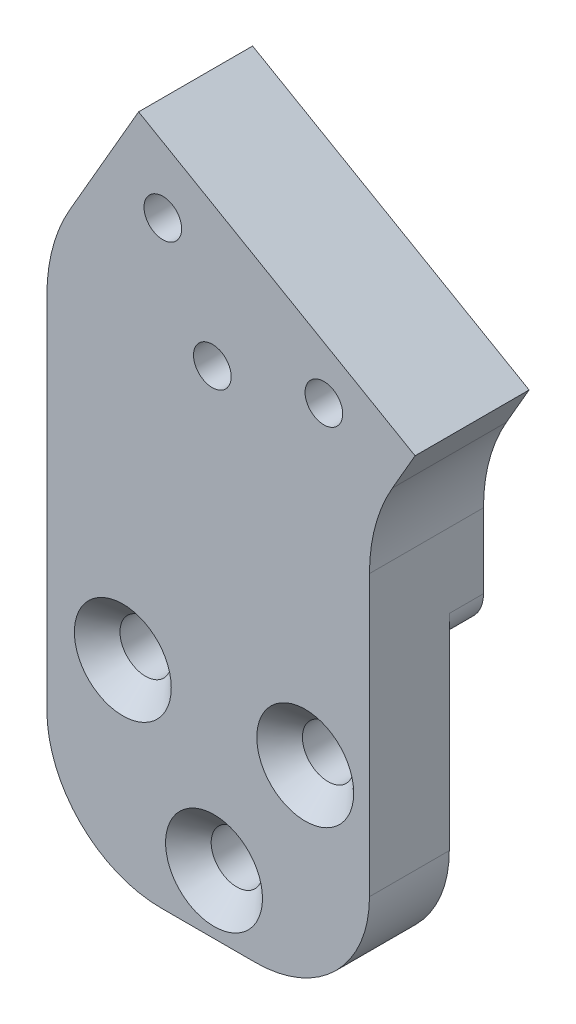
ISO-10303-21;
HEADER;
FILE_DESCRIPTION(('STEP AP214'),'2;1');
FILE_NAME('part.step','',(''),(''),'','','');
FILE_SCHEMA(('AUTOMOTIVE_DESIGN { 1 0 10303 214 1 1 1 1 }'));
ENDSEC;
DATA;
#1=APPLICATION_CONTEXT('core data for automotive mechanical design processes');
#2=APPLICATION_PROTOCOL_DEFINITION('international standard','automotive_design',2000,#1);
#3=PRODUCT_CONTEXT('',#1,'mechanical');
#4=PRODUCT('Part','Part','',(#3));
#5=PRODUCT_RELATED_PRODUCT_CATEGORY('part','',(#4));
#6=PRODUCT_DEFINITION_FORMATION('','',#4);
#7=PRODUCT_DEFINITION_CONTEXT('part definition',#1,'design');
#8=PRODUCT_DEFINITION('design','',#6,#7);
#9=PRODUCT_DEFINITION_SHAPE('','',#8);
#10=(LENGTH_UNIT() NAMED_UNIT(*) SI_UNIT(.MILLI.,.METRE.));
#11=(NAMED_UNIT(*) PLANE_ANGLE_UNIT() SI_UNIT($,.RADIAN.));
#12=(NAMED_UNIT(*) SI_UNIT($,.STERADIAN.) SOLID_ANGLE_UNIT());
#13=UNCERTAINTY_MEASURE_WITH_UNIT(LENGTH_MEASURE(1.E-05),#10,'distance_accuracy_value','');
#14=(GEOMETRIC_REPRESENTATION_CONTEXT(3) GLOBAL_UNCERTAINTY_ASSIGNED_CONTEXT((#13)) GLOBAL_UNIT_ASSIGNED_CONTEXT((#10,
#11,#12)) REPRESENTATION_CONTEXT('',''));
#15=CARTESIAN_POINT('',(0.,0.,0.));
#16=DIRECTION('',(0.,0.,1.));
#17=DIRECTION('',(1.,0.,0.));
#18=AXIS2_PLACEMENT_3D('',#15,#16,#17);
#19=CARTESIAN_POINT('',(-14.6578980201125,119.616999760779,-1.));
#20=DIRECTION('',(0.,-1.,0.));
#21=DIRECTION('',(0.,0.,-1.));
#22=AXIS2_PLACEMENT_3D('',#19,#20,#21);
#23=PLANE('',#22);
#24=DIRECTION('',(1.,0.,0.));
#25=VECTOR('',#24,1.);
#26=CARTESIAN_POINT('',(-14.6578980201125,119.616999760779,9.));
#27=LINE('',#26,#25);
#28=CARTESIAN_POINT('',(-4.65789802011249,119.616999760779,9.));
#29=VERTEX_POINT('',#28);
#30=CARTESIAN_POINT('',(3.63305587300541,119.616999760779,9.));
#31=VERTEX_POINT('',#30);
#32=EDGE_CURVE('E167',#29,#31,#27,.T.);
#33=ORIENTED_EDGE('',*,*,#32,.F.);
#34=DIRECTION('',(0.,0.,1.));
#35=VECTOR('',#34,1.);
#36=CARTESIAN_POINT('',(-4.65789802011249,119.616999760779,-1.));
#37=LINE('',#36,#35);
#38=CARTESIAN_POINT('',(-4.65789802011249,119.616999760779,2.));
#39=VERTEX_POINT('',#38);
#40=EDGE_CURVE('E228',#29,#39,#37,.F.);
#41=ORIENTED_EDGE('',*,*,#40,.T.);
#42=DIRECTION('',(1.,0.,0.));
#43=VECTOR('',#42,1.);
#44=CARTESIAN_POINT('',(-14.6578980201125,119.616999760779,2.));
#45=LINE('',#44,#43);
#46=CARTESIAN_POINT('',(3.63305587300541,119.616999760779,2.));
#47=VERTEX_POINT('',#46);
#48=EDGE_CURVE('E274',#39,#47,#45,.T.);
#49=ORIENTED_EDGE('',*,*,#48,.T.);
#50=DIRECTION('',(0.,0.,1.));
#51=VECTOR('',#50,1.);
#52=CARTESIAN_POINT('',(3.63305587300541,119.616999760779,-1.));
#53=LINE('',#52,#51);
#54=EDGE_CURVE('E225',#47,#31,#53,.T.);
#55=ORIENTED_EDGE('',*,*,#54,.T.);
#56=EDGE_LOOP('',(#33,#41,#49,#55));
#57=FACE_BOUND('',#56,.T.);
#58=ADVANCED_FACE('F33',(#57),#23,.T.);
#59=CARTESIAN_POINT('',(-14.6578980201125,119.616999760779,-1.));
#60=DIRECTION('',(-1.,0.,0.));
#61=DIRECTION('',(0.,0.,1.));
#62=AXIS2_PLACEMENT_3D('',#59,#60,#61);
#63=PLANE('',#62);
#64=DIRECTION('',(0.,-1.,0.));
#65=VECTOR('',#64,1.);
#66=CARTESIAN_POINT('',(-14.6578980201125,158.176865611019,-1.));
#67=LINE('',#66,#65);
#68=CARTESIAN_POINT('',(-14.6578980201125,161.156258187083,-1.));
#69=VERTEX_POINT('',#68);
#70=CARTESIAN_POINT('',(-14.6578980201125,147.55521431191,-1.));
#71=VERTEX_POINT('',#70);
#72=EDGE_CURVE('E157',#69,#71,#67,.T.);
#73=ORIENTED_EDGE('',*,*,#72,.T.);
#74=DIRECTION('',(0.,0.,1.));
#75=VECTOR('',#74,1.);
#76=CARTESIAN_POINT('',(-14.6578980201125,147.55521431191,2.));
#77=LINE('',#76,#75);
#78=CARTESIAN_POINT('',(-14.6578980201125,147.55521431191,2.));
#79=VERTEX_POINT('',#78);
#80=EDGE_CURVE('E247',#71,#79,#77,.T.);
#81=ORIENTED_EDGE('',*,*,#80,.T.);
#82=DIRECTION('',(0.,-1.,0.));
#83=VECTOR('',#82,1.);
#84=CARTESIAN_POINT('',(-14.6578980201125,119.616999760779,2.));
#85=LINE('',#84,#83);
#86=CARTESIAN_POINT('',(-14.6578980201125,129.616999760779,2.));
#87=VERTEX_POINT('',#86);
#88=EDGE_CURVE('E47',#79,#87,#85,.T.);
#89=ORIENTED_EDGE('',*,*,#88,.T.);
#90=DIRECTION('',(0.,0.,1.));
#91=VECTOR('',#90,1.);
#92=CARTESIAN_POINT('',(-14.6578980201125,129.616999760779,-1.));
#93=LINE('',#92,#91);
#94=CARTESIAN_POINT('',(-14.6578980201125,129.616999760779,9.));
#95=VERTEX_POINT('',#94);
#96=EDGE_CURVE('E218',#87,#95,#93,.T.);
#97=ORIENTED_EDGE('',*,*,#96,.T.);
#98=DIRECTION('',(0.,-1.,0.));
#99=VECTOR('',#98,1.);
#100=CARTESIAN_POINT('',(-14.6578980201125,158.176865611019,9.));
#101=LINE('',#100,#99);
#102=CARTESIAN_POINT('',(-14.6578980201125,161.156258187083,9.));
#103=VERTEX_POINT('',#102);
#104=EDGE_CURVE('E162',#103,#95,#101,.T.);
#105=ORIENTED_EDGE('',*,*,#104,.F.);
#106=DIRECTION('',(0.,0.,1.));
#107=VECTOR('',#106,1.);
#108=CARTESIAN_POINT('',(-14.6578980201125,161.156258187083,-1.));
#109=LINE('',#108,#107);
#110=EDGE_CURVE('E210',#103,#69,#109,.F.);
#111=ORIENTED_EDGE('',*,*,#110,.T.);
#112=EDGE_LOOP('',(#73,#81,#89,#97,#105,#111));
#113=FACE_BOUND('',#112,.T.);
#114=ADVANCED_FACE('F345',(#113),#63,.T.);
#115=CARTESIAN_POINT('',(-10.6156554329589,172.176865611019,-1.));
#116=DIRECTION('',(-0.866025403784438,0.500000000000001,0.));
#117=DIRECTION('',(-0.500000000000001,-0.866025403784438,0.));
#118=AXIS2_PLACEMENT_3D('',#115,#116,#117);
#119=PLANE('',#118);
#120=DIRECTION('',(-0.500000000000001,-0.866025403784438,0.));
#121=VECTOR('',#120,1.);
#122=CARTESIAN_POINT('',(-6.61565543295897,179.105068841294,-1.));
#123=LINE('',#122,#121);
#124=CARTESIAN_POINT('',(-6.61565543295897,179.105068841294,-1.));
#125=VERTEX_POINT('',#124);
#126=CARTESIAN_POINT('',(-12.6482790768791,168.656258187083,-1.));
#127=VERTEX_POINT('',#126);
#128=EDGE_CURVE('E175',#125,#127,#123,.T.);
#129=ORIENTED_EDGE('',*,*,#128,.T.);
#130=DIRECTION('',(0.,0.,1.));
#131=VECTOR('',#130,1.);
#132=CARTESIAN_POINT('',(-12.6482790768791,168.656258187083,-1.));
#133=LINE('',#132,#131);
#134=CARTESIAN_POINT('',(-12.6482790768791,168.656258187083,9.));
#135=VERTEX_POINT('',#134);
#136=EDGE_CURVE('E205',#127,#135,#133,.T.);
#137=ORIENTED_EDGE('',*,*,#136,.T.);
#138=DIRECTION('',(-0.500000000000001,-0.866025403784438,0.));
#139=VECTOR('',#138,1.);
#140=CARTESIAN_POINT('',(-6.61565543295897,179.105068841294,9.));
#141=LINE('',#140,#139);
#142=CARTESIAN_POINT('',(-6.61565543295897,179.105068841294,9.));
#143=VERTEX_POINT('',#142);
#144=EDGE_CURVE('E160',#143,#135,#141,.T.);
#145=ORIENTED_EDGE('',*,*,#144,.F.);
#146=DIRECTION('',(0.,0.,1.));
#147=VECTOR('',#146,1.);
#148=CARTESIAN_POINT('',(-6.61565543295897,179.105068841294,-1.));
#149=LINE('',#148,#147);
#150=EDGE_CURVE('E156',#125,#143,#149,.T.);
#151=ORIENTED_EDGE('',*,*,#150,.F.);
#152=EDGE_LOOP('',(#129,#137,#145,#151));
#153=FACE_BOUND('',#152,.T.);
#154=ADVANCED_FACE('F350',(#153),#119,.T.);
#155=CARTESIAN_POINT('',(-6.61565543295897,179.105068841294,-1.));
#156=DIRECTION('',(0.499999999999995,0.866025403784442,0.));
#157=DIRECTION('',(-0.866025403784442,0.499999999999995,0.));
#158=AXIS2_PLACEMENT_3D('',#155,#156,#157);
#159=PLANE('',#158);
#160=ORIENTED_EDGE('',*,*,#150,.T.);
#161=DIRECTION('',(-0.866025403784442,0.499999999999995,0.));
#162=VECTOR('',#161,1.);
#163=CARTESIAN_POINT('',(-6.61565543295897,179.105068841294,9.));
#164=LINE('',#163,#162);
#165=CARTESIAN_POINT('',(17.6330558730054,165.105068841294,9.));
#166=VERTEX_POINT('',#165);
#167=EDGE_CURVE('E140',#166,#143,#164,.T.);
#168=ORIENTED_EDGE('',*,*,#167,.F.);
#169=DIRECTION('',(0.,0.,1.));
#170=VECTOR('',#169,1.);
#171=CARTESIAN_POINT('',(17.6330558730054,165.105068841294,-1.));
#172=LINE('',#171,#170);
#173=CARTESIAN_POINT('',(17.6330558730054,165.105068841294,-1.));
#174=VERTEX_POINT('',#173);
#175=EDGE_CURVE('E149',#174,#166,#172,.T.);
#176=ORIENTED_EDGE('',*,*,#175,.F.);
#177=DIRECTION('',(-0.866025403784442,0.499999999999995,0.));
#178=VECTOR('',#177,1.);
#179=CARTESIAN_POINT('',(-6.61565543295897,179.105068841294,-1.));
#180=LINE('',#179,#178);
#181=EDGE_CURVE('E173',#174,#125,#180,.T.);
#182=ORIENTED_EDGE('',*,*,#181,.T.);
#183=EDGE_LOOP('',(#160,#168,#176,#182));
#184=FACE_BOUND('',#183,.T.);
#185=ADVANCED_FACE('F159',(#184),#159,.T.);
#186=CARTESIAN_POINT('',(17.6330558730054,165.105068841294,-1.));
#187=DIRECTION('',(0.866025403784442,-0.499999999999995,0.));
#188=DIRECTION('',(0.499999999999995,0.866025403784442,0.));
#189=AXIS2_PLACEMENT_3D('',#186,#187,#188);
#190=PLANE('',#189);
#191=DIRECTION('',(0.499999999999995,0.866025403784442,0.));
#192=VECTOR('',#191,1.);
#193=CARTESIAN_POINT('',(17.6330558730054,165.105068841294,9.));
#194=LINE('',#193,#192);
#195=CARTESIAN_POINT('',(15.6426748162388,161.657627724552,9.));
#196=VERTEX_POINT('',#195);
#197=EDGE_CURVE('E134',#196,#166,#194,.T.);
#198=ORIENTED_EDGE('',*,*,#197,.F.);
#199=DIRECTION('',(0.,0.,1.));
#200=VECTOR('',#199,1.);
#201=CARTESIAN_POINT('',(15.6426748162388,161.657627724552,-1.));
#202=LINE('',#201,#200);
#203=CARTESIAN_POINT('',(15.6426748162388,161.657627724552,-1.));
#204=VERTEX_POINT('',#203);
#205=EDGE_CURVE('E203',#196,#204,#202,.F.);
#206=ORIENTED_EDGE('',*,*,#205,.T.);
#207=DIRECTION('',(0.499999999999995,0.866025403784442,0.));
#208=VECTOR('',#207,1.);
#209=CARTESIAN_POINT('',(17.6330558730054,165.105068841294,-1.));
#210=LINE('',#209,#208);
#211=EDGE_CURVE('E152',#204,#174,#210,.T.);
#212=ORIENTED_EDGE('',*,*,#211,.T.);
#213=ORIENTED_EDGE('',*,*,#175,.T.);
#214=EDGE_LOOP('',(#198,#206,#212,#213));
#215=FACE_BOUND('',#214,.T.);
#216=ADVANCED_FACE('F150',(#215),#190,.T.);
#217=CARTESIAN_POINT('',(13.6330558730054,158.176865611019,-1.));
#218=DIRECTION('',(1.,0.,0.));
#219=DIRECTION('',(0.,0.,-1.));
#220=AXIS2_PLACEMENT_3D('',#217,#218,#219);
#221=PLANE('',#220);
#222=DIRECTION('',(0.,1.,0.));
#223=VECTOR('',#222,1.);
#224=CARTESIAN_POINT('',(13.6330558730054,158.176865611019,2.));
#225=LINE('',#224,#223);
#226=CARTESIAN_POINT('',(13.6330558730054,129.616999760779,2.));
#227=VERTEX_POINT('',#226);
#228=CARTESIAN_POINT('',(13.6330558730054,147.630069523674,2.));
#229=VERTEX_POINT('',#228);
#230=EDGE_CURVE('E183',#227,#229,#225,.T.);
#231=ORIENTED_EDGE('',*,*,#230,.T.);
#232=DIRECTION('',(0.,0.,1.));
#233=VECTOR('',#232,1.);
#234=CARTESIAN_POINT('',(13.6330558730054,147.630069523674,-1.));
#235=LINE('',#234,#233);
#236=CARTESIAN_POINT('',(13.6330558730054,147.630069523674,-1.));
#237=VERTEX_POINT('',#236);
#238=EDGE_CURVE('E242',#229,#237,#235,.F.);
#239=ORIENTED_EDGE('',*,*,#238,.T.);
#240=DIRECTION('',(0.,1.,0.));
#241=VECTOR('',#240,1.);
#242=CARTESIAN_POINT('',(13.6330558730054,119.616999760779,-1.));
#243=LINE('',#242,#241);
#244=CARTESIAN_POINT('',(13.6330558730054,154.157627724552,-1.));
#245=VERTEX_POINT('',#244);
#246=EDGE_CURVE('E170',#237,#245,#243,.T.);
#247=ORIENTED_EDGE('',*,*,#246,.T.);
#248=DIRECTION('',(0.,0.,1.));
#249=VECTOR('',#248,1.);
#250=CARTESIAN_POINT('',(13.6330558730054,154.157627724552,9.));
#251=LINE('',#250,#249);
#252=CARTESIAN_POINT('',(13.6330558730054,154.157627724552,9.));
#253=VERTEX_POINT('',#252);
#254=EDGE_CURVE('E185',#245,#253,#251,.T.);
#255=ORIENTED_EDGE('',*,*,#254,.T.);
#256=DIRECTION('',(0.,1.,0.));
#257=VECTOR('',#256,1.);
#258=CARTESIAN_POINT('',(13.6330558730054,119.616999760779,9.));
#259=LINE('',#258,#257);
#260=CARTESIAN_POINT('',(13.6330558730054,129.616999760779,9.));
#261=VERTEX_POINT('',#260);
#262=EDGE_CURVE('E146',#261,#253,#259,.T.);
#263=ORIENTED_EDGE('',*,*,#262,.F.);
#264=DIRECTION('',(0.,0.,1.));
#265=VECTOR('',#264,1.);
#266=CARTESIAN_POINT('',(13.6330558730054,129.616999760779,-1.));
#267=LINE('',#266,#265);
#268=EDGE_CURVE('E234',#261,#227,#267,.F.);
#269=ORIENTED_EDGE('',*,*,#268,.T.);
#270=EDGE_LOOP('',(#231,#239,#247,#255,#263,#269));
#271=FACE_BOUND('',#270,.T.);
#272=ADVANCED_FACE('F262',(#271),#221,.T.);
#273=CARTESIAN_POINT('',(0.,0.,-1.));
#274=DIRECTION('',(0.,0.,-1.));
#275=DIRECTION('',(-1.,0.,0.));
#276=AXIS2_PLACEMENT_3D('',#273,#274,#275);
#277=PLANE('',#276);
#278=CARTESIAN_POINT('',(-4.4912997799768,172.105068841294,-1.));
#279=DIRECTION('',(0.,0.,-1.));
#280=DIRECTION('',(-1.,0.,0.));
#281=AXIS2_PLACEMENT_3D('',#278,#279,#280);
#282=CIRCLE('',#281,1.65000000000001);
#283=CARTESIAN_POINT('',(-6.1412997799768,172.105068841294,-1.));
#284=VERTEX_POINT('',#283);
#285=EDGE_CURVE('E309',#284,#284,#282,.T.);
#286=ORIENTED_EDGE('',*,*,#285,.F.);
#287=EDGE_LOOP('',(#286));
#288=FACE_BOUND('',#287,.T.);
#289=CARTESIAN_POINT('',(9.63305587300538,165.105068841294,-1.));
#290=DIRECTION('',(0.,0.,-1.));
#291=DIRECTION('',(-1.,0.,0.));
#292=AXIS2_PLACEMENT_3D('',#289,#290,#291);
#293=CIRCLE('',#292,1.65000000000001);
#294=CARTESIAN_POINT('',(7.98305587300537,165.105068841294,-1.));
#295=VERTEX_POINT('',#294);
#296=EDGE_CURVE('E303',#295,#295,#293,.T.);
#297=ORIENTED_EDGE('',*,*,#296,.F.);
#298=EDGE_LOOP('',(#297));
#299=FACE_BOUND('',#298,.T.);
#300=CARTESIAN_POINT('',(-0.146785414448515,163.038543863621,-1.));
#301=DIRECTION('',(0.,0.,-1.));
#302=DIRECTION('',(-1.,0.,0.));
#303=AXIS2_PLACEMENT_3D('',#300,#301,#302);
#304=CIRCLE('',#303,1.65000000000001);
#305=CARTESIAN_POINT('',(-1.79678541444852,163.038543863621,-1.));
#306=VERTEX_POINT('',#305);
#307=EDGE_CURVE('E297',#306,#306,#304,.T.);
#308=ORIENTED_EDGE('',*,*,#307,.F.);
#309=EDGE_LOOP('',(#308));
#310=FACE_BOUND('',#309,.T.);
#311=ORIENTED_EDGE('',*,*,#246,.F.);
#312=CARTESIAN_POINT('',(10.6330558730054,147.630069523674,-1.));
#313=DIRECTION('',(0.,0.,-1.));
#314=DIRECTION('',(-1.,0.,0.));
#315=AXIS2_PLACEMENT_3D('',#312,#313,#314);
#316=CIRCLE('',#315,3.);
#317=CARTESIAN_POINT('',(10.4245645813779,144.637323062426,-1.));
#318=VERTEX_POINT('',#317);
#319=EDGE_CURVE('E245',#237,#318,#316,.T.);
#320=ORIENTED_EDGE('',*,*,#319,.T.);
#321=CARTESIAN_POINT('',(0.,-4.99999999999998,-1.));
#322=DIRECTION('',(0.,0.,-1.));
#323=DIRECTION('',(-1.,0.,0.));
#324=AXIS2_PLACEMENT_3D('',#321,#322,#323);
#325=CIRCLE('',#324,150.);
#326=CARTESIAN_POINT('',(-11.429311784424,144.563935599911,-1.));
#327=VERTEX_POINT('',#326);
#328=EDGE_CURVE('E179',#327,#318,#325,.T.);
#329=ORIENTED_EDGE('',*,*,#328,.F.);
#330=CARTESIAN_POINT('',(-11.6578980201125,147.55521431191,-1.));
#331=DIRECTION('',(0.,0.,-1.));
#332=DIRECTION('',(-1.,0.,0.));
#333=AXIS2_PLACEMENT_3D('',#330,#331,#332);
#334=CIRCLE('',#333,3.);
#335=EDGE_CURVE('E55',#327,#71,#334,.T.);
#336=ORIENTED_EDGE('',*,*,#335,.T.);
#337=ORIENTED_EDGE('',*,*,#72,.F.);
#338=CARTESIAN_POINT('',(0.342101979887509,161.156258187083,-1.));
#339=DIRECTION('',(0.,0.,-1.));
#340=DIRECTION('',(-1.,0.,0.));
#341=AXIS2_PLACEMENT_3D('',#338,#339,#340);
#342=CIRCLE('',#341,15.);
#343=EDGE_CURVE('E212',#69,#127,#342,.T.);
#344=ORIENTED_EDGE('',*,*,#343,.T.);
#345=ORIENTED_EDGE('',*,*,#128,.F.);
#346=ORIENTED_EDGE('',*,*,#181,.F.);
#347=ORIENTED_EDGE('',*,*,#211,.F.);
#348=CARTESIAN_POINT('',(28.6330558730054,154.157627724552,-1.));
#349=DIRECTION('',(0.,0.,-1.));
#350=DIRECTION('',(-1.,0.,0.));
#351=AXIS2_PLACEMENT_3D('',#348,#349,#350);
#352=CIRCLE('',#351,15.);
#353=EDGE_CURVE('E215',#204,#245,#352,.F.);
#354=ORIENTED_EDGE('',*,*,#353,.T.);
#355=EDGE_LOOP('',(#311,#320,#329,#336,#337,#344,#345,#346,#347,#354));
#356=FACE_BOUND('',#355,.T.);
#357=ADVANCED_FACE('F263',(#288,#299,#310,#356),#277,.T.);
#358=CARTESIAN_POINT('',(0.,0.,9.));
#359=DIRECTION('',(0.,0.,-1.));
#360=DIRECTION('',(-1.,0.,0.));
#361=AXIS2_PLACEMENT_3D('',#358,#359,#360);
#362=PLANE('',#361);
#363=CARTESIAN_POINT('',(-4.4912997799768,172.105068841294,9.));
#364=DIRECTION('',(0.,0.,-1.));
#365=DIRECTION('',(-1.,0.,0.));
#366=AXIS2_PLACEMENT_3D('',#363,#364,#365);
#367=CIRCLE('',#366,1.65000000000001);
#368=CARTESIAN_POINT('',(-6.1412997799768,172.105068841294,9.));
#369=VERTEX_POINT('',#368);
#370=EDGE_CURVE('E296',#369,#369,#367,.T.);
#371=ORIENTED_EDGE('',*,*,#370,.T.);
#372=EDGE_LOOP('',(#371));
#373=FACE_BOUND('',#372,.T.);
#374=CARTESIAN_POINT('',(9.63305587300538,165.105068841294,9.));
#375=DIRECTION('',(0.,0.,-1.));
#376=DIRECTION('',(-1.,0.,0.));
#377=AXIS2_PLACEMENT_3D('',#374,#375,#376);
#378=CIRCLE('',#377,1.65000000000001);
#379=CARTESIAN_POINT('',(7.98305587300537,165.105068841294,9.));
#380=VERTEX_POINT('',#379);
#381=EDGE_CURVE('E306',#380,#380,#378,.T.);
#382=ORIENTED_EDGE('',*,*,#381,.T.);
#383=EDGE_LOOP('',(#382));
#384=FACE_BOUND('',#383,.T.);
#385=CARTESIAN_POINT('',(-0.146785414448515,163.038543863621,9.));
#386=DIRECTION('',(0.,0.,-1.));
#387=DIRECTION('',(-1.,0.,0.));
#388=AXIS2_PLACEMENT_3D('',#385,#386,#387);
#389=CIRCLE('',#388,1.65000000000001);
#390=CARTESIAN_POINT('',(-1.79678541444852,163.038543863621,9.));
#391=VERTEX_POINT('',#390);
#392=EDGE_CURVE('E300',#391,#391,#389,.T.);
#393=ORIENTED_EDGE('',*,*,#392,.T.);
#394=EDGE_LOOP('',(#393));
#395=FACE_BOUND('',#394,.T.);
#396=CARTESIAN_POINT('',(8.,136.785930713577,9.));
#397=DIRECTION('',(0.,0.,1.));
#398=DIRECTION('',(1.,0.,0.));
#399=AXIS2_PLACEMENT_3D('',#396,#397,#398);
#400=CIRCLE('',#399,4.25);
#401=CARTESIAN_POINT('',(12.25,136.785930713577,9.));
#402=VERTEX_POINT('',#401);
#403=EDGE_CURVE('E293',#402,#402,#400,.T.);
#404=ORIENTED_EDGE('',*,*,#403,.F.);
#405=EDGE_LOOP('',(#404));
#406=FACE_BOUND('',#405,.T.);
#407=CARTESIAN_POINT('',(-8.,136.785930713577,9.));
#408=DIRECTION('',(0.,0.,1.));
#409=DIRECTION('',(1.,0.,0.));
#410=AXIS2_PLACEMENT_3D('',#407,#408,#409);
#411=CIRCLE('',#410,4.25);
#412=CARTESIAN_POINT('',(-3.75,136.785930713577,9.));
#413=VERTEX_POINT('',#412);
#414=EDGE_CURVE('E199',#413,#413,#411,.T.);
#415=ORIENTED_EDGE('',*,*,#414,.F.);
#416=EDGE_LOOP('',(#415));
#417=FACE_BOUND('',#416,.T.);
#418=CARTESIAN_POINT('',(0.,124.785930713577,9.));
#419=DIRECTION('',(0.,0.,1.));
#420=DIRECTION('',(1.,0.,0.));
#421=AXIS2_PLACEMENT_3D('',#418,#419,#420);
#422=CIRCLE('',#421,4.25);
#423=CARTESIAN_POINT('',(4.25,124.785930713577,9.));
#424=VERTEX_POINT('',#423);
#425=EDGE_CURVE('E194',#424,#424,#422,.T.);
#426=ORIENTED_EDGE('',*,*,#425,.F.);
#427=EDGE_LOOP('',(#426));
#428=FACE_BOUND('',#427,.T.);
#429=ORIENTED_EDGE('',*,*,#104,.T.);
#430=CARTESIAN_POINT('',(-4.65789802011249,129.616999760779,9.));
#431=DIRECTION('',(0.,0.,-1.));
#432=DIRECTION('',(-1.,0.,0.));
#433=AXIS2_PLACEMENT_3D('',#430,#431,#432);
#434=CIRCLE('',#433,10.);
#435=EDGE_CURVE('E223',#95,#29,#434,.F.);
#436=ORIENTED_EDGE('',*,*,#435,.T.);
#437=ORIENTED_EDGE('',*,*,#32,.T.);
#438=CARTESIAN_POINT('',(3.63305587300541,129.616999760779,9.));
#439=DIRECTION('',(0.,0.,-1.));
#440=DIRECTION('',(-1.,0.,0.));
#441=AXIS2_PLACEMENT_3D('',#438,#439,#440);
#442=CIRCLE('',#441,10.);
#443=EDGE_CURVE('E221',#31,#261,#442,.F.);
#444=ORIENTED_EDGE('',*,*,#443,.T.);
#445=ORIENTED_EDGE('',*,*,#262,.T.);
#446=CARTESIAN_POINT('',(28.6330558730054,154.157627724552,9.));
#447=DIRECTION('',(0.,0.,-1.));
#448=DIRECTION('',(-1.,0.,0.));
#449=AXIS2_PLACEMENT_3D('',#446,#447,#448);
#450=CIRCLE('',#449,15.);
#451=EDGE_CURVE('E143',#253,#196,#450,.T.);
#452=ORIENTED_EDGE('',*,*,#451,.T.);
#453=ORIENTED_EDGE('',*,*,#197,.T.);
#454=ORIENTED_EDGE('',*,*,#167,.T.);
#455=ORIENTED_EDGE('',*,*,#144,.T.);
#456=CARTESIAN_POINT('',(0.342101979887509,161.156258187083,9.));
#457=DIRECTION('',(0.,0.,-1.));
#458=DIRECTION('',(-1.,0.,0.));
#459=AXIS2_PLACEMENT_3D('',#456,#457,#458);
#460=CIRCLE('',#459,15.);
#461=EDGE_CURVE('E208',#135,#103,#460,.F.);
#462=ORIENTED_EDGE('',*,*,#461,.T.);
#463=EDGE_LOOP('',(#429,#436,#437,#444,#445,#452,#453,#454,#455,#462));
#464=FACE_BOUND('',#463,.T.);
#465=ADVANCED_FACE('F137',(#373,#384,#395,#406,#417,#428,#464),#362,.F.);
#466=CARTESIAN_POINT('',(0.,-4.99999999999998,2.));
#467=DIRECTION('',(0.,0.,-1.));
#468=DIRECTION('',(-1.,0.,0.));
#469=AXIS2_PLACEMENT_3D('',#466,#467,#468);
#470=CYLINDRICAL_SURFACE('',#469,150.);
#471=ORIENTED_EDGE('',*,*,#328,.T.);
#472=DIRECTION('',(0.,0.,-1.));
#473=VECTOR('',#472,1.);
#474=CARTESIAN_POINT('',(10.4245645813779,144.637323062426,2.));
#475=LINE('',#474,#473);
#476=CARTESIAN_POINT('',(10.4245645813779,144.637323062426,2.));
#477=VERTEX_POINT('',#476);
#478=EDGE_CURVE('E239',#318,#477,#475,.F.);
#479=ORIENTED_EDGE('',*,*,#478,.T.);
#480=CARTESIAN_POINT('',(0.,-4.99999999999998,2.));
#481=DIRECTION('',(0.,0.,-1.));
#482=DIRECTION('',(-1.,0.,0.));
#483=AXIS2_PLACEMENT_3D('',#480,#481,#482);
#484=CIRCLE('',#483,150.);
#485=CARTESIAN_POINT('',(-11.429311784424,144.563935599911,2.));
#486=VERTEX_POINT('',#485);
#487=EDGE_CURVE('E189',#486,#477,#484,.T.);
#488=ORIENTED_EDGE('',*,*,#487,.F.);
#489=DIRECTION('',(0.,0.,-1.));
#490=VECTOR('',#489,1.);
#491=CARTESIAN_POINT('',(-11.429311784424,144.563935599911,2.));
#492=LINE('',#491,#490);
#493=EDGE_CURVE('E236',#486,#327,#492,.T.);
#494=ORIENTED_EDGE('',*,*,#493,.T.);
#495=EDGE_LOOP('',(#471,#479,#488,#494));
#496=FACE_BOUND('',#495,.T.);
#497=ADVANCED_FACE('F402',(#496),#470,.F.);
#498=CARTESIAN_POINT('',(0.,-4.99999999999998,2.));
#499=DIRECTION('',(0.,0.,-1.));
#500=DIRECTION('',(-1.,0.,0.));
#501=AXIS2_PLACEMENT_3D('',#498,#499,#500);
#502=PLANE('',#501);
#503=CARTESIAN_POINT('',(8.,136.785930713577,2.));
#504=DIRECTION('',(0.,0.,-1.));
#505=DIRECTION('',(-1.,0.,0.));
#506=AXIS2_PLACEMENT_3D('',#503,#504,#505);
#507=CIRCLE('',#506,2.25);
#508=CARTESIAN_POINT('',(5.75,136.785930713577,2.));
#509=VERTEX_POINT('',#508);
#510=EDGE_CURVE('E196',#509,#509,#507,.T.);
#511=ORIENTED_EDGE('',*,*,#510,.F.);
#512=EDGE_LOOP('',(#511));
#513=FACE_BOUND('',#512,.T.);
#514=CARTESIAN_POINT('',(-8.,136.785930713577,2.));
#515=DIRECTION('',(0.,0.,-1.));
#516=DIRECTION('',(-1.,0.,0.));
#517=AXIS2_PLACEMENT_3D('',#514,#515,#516);
#518=CIRCLE('',#517,2.25);
#519=CARTESIAN_POINT('',(-10.25,136.785930713577,2.));
#520=VERTEX_POINT('',#519);
#521=EDGE_CURVE('E191',#520,#520,#518,.T.);
#522=ORIENTED_EDGE('',*,*,#521,.F.);
#523=EDGE_LOOP('',(#522));
#524=FACE_BOUND('',#523,.T.);
#525=CARTESIAN_POINT('',(0.,124.785930713577,2.));
#526=DIRECTION('',(0.,0.,-1.));
#527=DIRECTION('',(-1.,0.,0.));
#528=AXIS2_PLACEMENT_3D('',#525,#526,#527);
#529=CIRCLE('',#528,2.25);
#530=CARTESIAN_POINT('',(-2.25,124.785930713577,2.));
#531=VERTEX_POINT('',#530);
#532=EDGE_CURVE('E186',#531,#531,#529,.T.);
#533=ORIENTED_EDGE('',*,*,#532,.F.);
#534=EDGE_LOOP('',(#533));
#535=FACE_BOUND('',#534,.T.);
#536=ORIENTED_EDGE('',*,*,#48,.F.);
#537=CARTESIAN_POINT('',(-4.65789802011249,129.616999760779,2.));
#538=DIRECTION('',(0.,0.,-1.));
#539=DIRECTION('',(-1.,0.,0.));
#540=AXIS2_PLACEMENT_3D('',#537,#538,#539);
#541=CIRCLE('',#540,10.);
#542=EDGE_CURVE('E232',#39,#87,#541,.T.);
#543=ORIENTED_EDGE('',*,*,#542,.T.);
#544=ORIENTED_EDGE('',*,*,#88,.F.);
#545=CARTESIAN_POINT('',(-11.6578980201125,147.55521431191,2.));
#546=DIRECTION('',(0.,0.,-1.));
#547=DIRECTION('',(-1.,0.,0.));
#548=AXIS2_PLACEMENT_3D('',#545,#546,#547);
#549=CIRCLE('',#548,3.);
#550=EDGE_CURVE('E11',#79,#486,#549,.F.);
#551=ORIENTED_EDGE('',*,*,#550,.T.);
#552=ORIENTED_EDGE('',*,*,#487,.T.);
#553=CARTESIAN_POINT('',(10.6330558730054,147.630069523674,2.));
#554=DIRECTION('',(0.,0.,-1.));
#555=DIRECTION('',(-1.,0.,0.));
#556=AXIS2_PLACEMENT_3D('',#553,#554,#555);
#557=CIRCLE('',#556,3.);
#558=EDGE_CURVE('E41',#477,#229,#557,.F.);
#559=ORIENTED_EDGE('',*,*,#558,.T.);
#560=ORIENTED_EDGE('',*,*,#230,.F.);
#561=CARTESIAN_POINT('',(3.63305587300541,129.616999760779,2.));
#562=DIRECTION('',(0.,0.,-1.));
#563=DIRECTION('',(-1.,0.,0.));
#564=AXIS2_PLACEMENT_3D('',#561,#562,#563);
#565=CIRCLE('',#564,10.);
#566=EDGE_CURVE('E230',#227,#47,#565,.T.);
#567=ORIENTED_EDGE('',*,*,#566,.T.);
#568=EDGE_LOOP('',(#536,#543,#544,#551,#552,#559,#560,#567));
#569=FACE_BOUND('',#568,.T.);
#570=ADVANCED_FACE('F253',(#513,#524,#535,#569),#502,.T.);
#571=CARTESIAN_POINT('',(0.,124.785930713577,9.));
#572=DIRECTION('',(0.,0.,1.));
#573=DIRECTION('',(1.,0.,0.));
#574=AXIS2_PLACEMENT_3D('',#571,#572,#573);
#575=CYLINDRICAL_SURFACE('',#574,2.25);
#576=ORIENTED_EDGE('',*,*,#532,.T.);
#577=EDGE_LOOP('',(#576));
#578=FACE_BOUND('',#577,.T.);
#579=CARTESIAN_POINT('',(0.,124.785930713577,7.));
#580=DIRECTION('',(0.,0.,1.));
#581=DIRECTION('',(1.,0.,0.));
#582=AXIS2_PLACEMENT_3D('',#579,#580,#581);
#583=CIRCLE('',#582,2.25);
#584=CARTESIAN_POINT('',(2.25,124.785930713577,7.));
#585=VERTEX_POINT('',#584);
#586=EDGE_CURVE('E190',#585,#585,#583,.T.);
#587=ORIENTED_EDGE('',*,*,#586,.T.);
#588=EDGE_LOOP('',(#587));
#589=FACE_BOUND('',#588,.T.);
#590=ADVANCED_FACE('F433',(#578,#589),#575,.F.);
#591=CARTESIAN_POINT('',(0.,124.785930713577,9.));
#592=DIRECTION('',(0.,0.,1.));
#593=DIRECTION('',(1.,0.,0.));
#594=AXIS2_PLACEMENT_3D('',#591,#592,#593);
#595=CONICAL_SURFACE('',#594,4.25,0.785398163397448);
#596=ORIENTED_EDGE('',*,*,#586,.F.);
#597=EDGE_LOOP('',(#596));
#598=FACE_BOUND('',#597,.T.);
#599=ORIENTED_EDGE('',*,*,#425,.T.);
#600=EDGE_LOOP('',(#599));
#601=FACE_BOUND('',#600,.T.);
#602=ADVANCED_FACE('F441',(#598,#601),#595,.F.);
#603=CARTESIAN_POINT('',(-8.,136.785930713577,9.));
#604=DIRECTION('',(0.,0.,1.));
#605=DIRECTION('',(1.,0.,0.));
#606=AXIS2_PLACEMENT_3D('',#603,#604,#605);
#607=CYLINDRICAL_SURFACE('',#606,2.25);
#608=ORIENTED_EDGE('',*,*,#521,.T.);
#609=EDGE_LOOP('',(#608));
#610=FACE_BOUND('',#609,.T.);
#611=CARTESIAN_POINT('',(-8.,136.785930713577,7.));
#612=DIRECTION('',(0.,0.,1.));
#613=DIRECTION('',(1.,0.,0.));
#614=AXIS2_PLACEMENT_3D('',#611,#612,#613);
#615=CIRCLE('',#614,2.25);
#616=CARTESIAN_POINT('',(-5.75,136.785930713577,7.));
#617=VERTEX_POINT('',#616);
#618=EDGE_CURVE('E195',#617,#617,#615,.T.);
#619=ORIENTED_EDGE('',*,*,#618,.T.);
#620=EDGE_LOOP('',(#619));
#621=FACE_BOUND('',#620,.T.);
#622=ADVANCED_FACE('F450',(#610,#621),#607,.F.);
#623=CARTESIAN_POINT('',(-8.,136.785930713577,9.));
#624=DIRECTION('',(0.,0.,1.));
#625=DIRECTION('',(1.,0.,0.));
#626=AXIS2_PLACEMENT_3D('',#623,#624,#625);
#627=CONICAL_SURFACE('',#626,4.25,0.785398163397448);
#628=ORIENTED_EDGE('',*,*,#618,.F.);
#629=EDGE_LOOP('',(#628));
#630=FACE_BOUND('',#629,.T.);
#631=ORIENTED_EDGE('',*,*,#414,.T.);
#632=EDGE_LOOP('',(#631));
#633=FACE_BOUND('',#632,.T.);
#634=ADVANCED_FACE('F458',(#630,#633),#627,.F.);
#635=CARTESIAN_POINT('',(8.,136.785930713577,9.));
#636=DIRECTION('',(0.,0.,1.));
#637=DIRECTION('',(1.,0.,0.));
#638=AXIS2_PLACEMENT_3D('',#635,#636,#637);
#639=CYLINDRICAL_SURFACE('',#638,2.25);
#640=ORIENTED_EDGE('',*,*,#510,.T.);
#641=EDGE_LOOP('',(#640));
#642=FACE_BOUND('',#641,.T.);
#643=CARTESIAN_POINT('',(8.,136.785930713577,7.));
#644=DIRECTION('',(0.,0.,1.));
#645=DIRECTION('',(1.,0.,0.));
#646=AXIS2_PLACEMENT_3D('',#643,#644,#645);
#647=CIRCLE('',#646,2.25);
#648=CARTESIAN_POINT('',(10.25,136.785930713577,7.));
#649=VERTEX_POINT('',#648);
#650=EDGE_CURVE('E200',#649,#649,#647,.T.);
#651=ORIENTED_EDGE('',*,*,#650,.T.);
#652=EDGE_LOOP('',(#651));
#653=FACE_BOUND('',#652,.T.);
#654=ADVANCED_FACE('F466',(#642,#653),#639,.F.);
#655=CARTESIAN_POINT('',(8.,136.785930713577,9.));
#656=DIRECTION('',(0.,0.,1.));
#657=DIRECTION('',(1.,0.,0.));
#658=AXIS2_PLACEMENT_3D('',#655,#656,#657);
#659=CONICAL_SURFACE('',#658,4.25,0.785398163397448);
#660=ORIENTED_EDGE('',*,*,#650,.F.);
#661=EDGE_LOOP('',(#660));
#662=FACE_BOUND('',#661,.T.);
#663=ORIENTED_EDGE('',*,*,#403,.T.);
#664=EDGE_LOOP('',(#663));
#665=FACE_BOUND('',#664,.T.);
#666=ADVANCED_FACE('F367',(#662,#665),#659,.F.);
#667=CARTESIAN_POINT('',(28.6330558730054,154.157627724552,-1.));
#668=DIRECTION('',(0.,0.,-1.));
#669=DIRECTION('',(-1.,0.,0.));
#670=AXIS2_PLACEMENT_3D('',#667,#668,#669);
#671=CYLINDRICAL_SURFACE('',#670,15.);
#672=ORIENTED_EDGE('',*,*,#353,.F.);
#673=ORIENTED_EDGE('',*,*,#205,.F.);
#674=ORIENTED_EDGE('',*,*,#451,.F.);
#675=ORIENTED_EDGE('',*,*,#254,.F.);
#676=EDGE_LOOP('',(#672,#673,#674,#675));
#677=FACE_BOUND('',#676,.T.);
#678=ADVANCED_FACE('F267',(#677),#671,.F.);
#679=CARTESIAN_POINT('',(0.342101979887509,161.156258187083,-1.));
#680=DIRECTION('',(0.,0.,1.));
#681=DIRECTION('',(1.,0.,0.));
#682=AXIS2_PLACEMENT_3D('',#679,#680,#681);
#683=CYLINDRICAL_SURFACE('',#682,15.);
#684=ORIENTED_EDGE('',*,*,#343,.F.);
#685=ORIENTED_EDGE('',*,*,#110,.F.);
#686=ORIENTED_EDGE('',*,*,#461,.F.);
#687=ORIENTED_EDGE('',*,*,#136,.F.);
#688=EDGE_LOOP('',(#684,#685,#686,#687));
#689=FACE_BOUND('',#688,.T.);
#690=ADVANCED_FACE('F366',(#689),#683,.T.);
#691=CARTESIAN_POINT('',(-4.65789802011249,129.616999760779,-1.));
#692=DIRECTION('',(0.,0.,1.));
#693=DIRECTION('',(1.,0.,0.));
#694=AXIS2_PLACEMENT_3D('',#691,#692,#693);
#695=CYLINDRICAL_SURFACE('',#694,10.);
#696=ORIENTED_EDGE('',*,*,#542,.F.);
#697=ORIENTED_EDGE('',*,*,#40,.F.);
#698=ORIENTED_EDGE('',*,*,#435,.F.);
#699=ORIENTED_EDGE('',*,*,#96,.F.);
#700=EDGE_LOOP('',(#696,#697,#698,#699));
#701=FACE_BOUND('',#700,.T.);
#702=ADVANCED_FACE('F370',(#701),#695,.T.);
#703=CARTESIAN_POINT('',(3.63305587300541,129.616999760779,-1.));
#704=DIRECTION('',(0.,0.,1.));
#705=DIRECTION('',(1.,0.,0.));
#706=AXIS2_PLACEMENT_3D('',#703,#704,#705);
#707=CYLINDRICAL_SURFACE('',#706,10.);
#708=ORIENTED_EDGE('',*,*,#566,.F.);
#709=ORIENTED_EDGE('',*,*,#268,.F.);
#710=ORIENTED_EDGE('',*,*,#443,.F.);
#711=ORIENTED_EDGE('',*,*,#54,.F.);
#712=EDGE_LOOP('',(#708,#709,#710,#711));
#713=FACE_BOUND('',#712,.T.);
#714=ADVANCED_FACE('F271',(#713),#707,.T.);
#715=CARTESIAN_POINT('',(10.6330558730054,147.630069523674,2.));
#716=DIRECTION('',(0.,0.,-1.));
#717=DIRECTION('',(-1.,0.,0.));
#718=AXIS2_PLACEMENT_3D('',#715,#716,#717);
#719=CYLINDRICAL_SURFACE('',#718,3.);
#720=ORIENTED_EDGE('',*,*,#319,.F.);
#721=ORIENTED_EDGE('',*,*,#238,.F.);
#722=ORIENTED_EDGE('',*,*,#558,.F.);
#723=ORIENTED_EDGE('',*,*,#478,.F.);
#724=EDGE_LOOP('',(#720,#721,#722,#723));
#725=FACE_BOUND('',#724,.T.);
#726=ADVANCED_FACE('F259',(#725),#719,.T.);
#727=CARTESIAN_POINT('',(-11.6578980201125,147.55521431191,2.));
#728=DIRECTION('',(0.,0.,-1.));
#729=DIRECTION('',(-1.,0.,0.));
#730=AXIS2_PLACEMENT_3D('',#727,#728,#729);
#731=CYLINDRICAL_SURFACE('',#730,3.);
#732=ORIENTED_EDGE('',*,*,#550,.F.);
#733=ORIENTED_EDGE('',*,*,#80,.F.);
#734=ORIENTED_EDGE('',*,*,#335,.F.);
#735=ORIENTED_EDGE('',*,*,#493,.F.);
#736=EDGE_LOOP('',(#732,#733,#734,#735));
#737=FACE_BOUND('',#736,.T.);
#738=ADVANCED_FACE('F35',(#737),#731,.T.);
#739=CARTESIAN_POINT('',(-0.146785414448515,163.038543863621,9.));
#740=DIRECTION('',(0.,0.,-1.));
#741=DIRECTION('',(-1.,0.,0.));
#742=AXIS2_PLACEMENT_3D('',#739,#740,#741);
#743=CYLINDRICAL_SURFACE('',#742,1.65000000000001);
#744=ORIENTED_EDGE('',*,*,#392,.F.);
#745=EDGE_LOOP('',(#744));
#746=FACE_BOUND('',#745,.T.);
#747=ORIENTED_EDGE('',*,*,#307,.T.);
#748=EDGE_LOOP('',(#747));
#749=FACE_BOUND('',#748,.T.);
#750=ADVANCED_FACE('F331',(#746,#749),#743,.F.);
#751=CARTESIAN_POINT('',(9.63305587300538,165.105068841294,9.));
#752=DIRECTION('',(0.,0.,-1.));
#753=DIRECTION('',(-1.,0.,0.));
#754=AXIS2_PLACEMENT_3D('',#751,#752,#753);
#755=CYLINDRICAL_SURFACE('',#754,1.65000000000001);
#756=ORIENTED_EDGE('',*,*,#381,.F.);
#757=EDGE_LOOP('',(#756));
#758=FACE_BOUND('',#757,.T.);
#759=ORIENTED_EDGE('',*,*,#296,.T.);
#760=EDGE_LOOP('',(#759));
#761=FACE_BOUND('',#760,.T.);
#762=ADVANCED_FACE('F320',(#758,#761),#755,.F.);
#763=CARTESIAN_POINT('',(-4.4912997799768,172.105068841294,9.));
#764=DIRECTION('',(0.,0.,-1.));
#765=DIRECTION('',(-1.,0.,0.));
#766=AXIS2_PLACEMENT_3D('',#763,#764,#765);
#767=CYLINDRICAL_SURFACE('',#766,1.65000000000001);
#768=ORIENTED_EDGE('',*,*,#370,.F.);
#769=EDGE_LOOP('',(#768));
#770=FACE_BOUND('',#769,.T.);
#771=ORIENTED_EDGE('',*,*,#285,.T.);
#772=EDGE_LOOP('',(#771));
#773=FACE_BOUND('',#772,.T.);
#774=ADVANCED_FACE('F317',(#770,#773),#767,.F.);
#775=CLOSED_SHELL('',(#58,#114,#154,#185,#216,#272,#357,#465,#497,#570,#590,#602,#622,#634,#654,
#666,#678,#690,#702,#714,#726,#738,#750,#762,#774));
#776=MANIFOLD_SOLID_BREP('B2',#775);
#777=ADVANCED_BREP_SHAPE_REPRESENTATION('',(#18,#776),#14);
#778=SHAPE_DEFINITION_REPRESENTATION(#9,#777);
ENDSEC;
END-ISO-10303-21;
